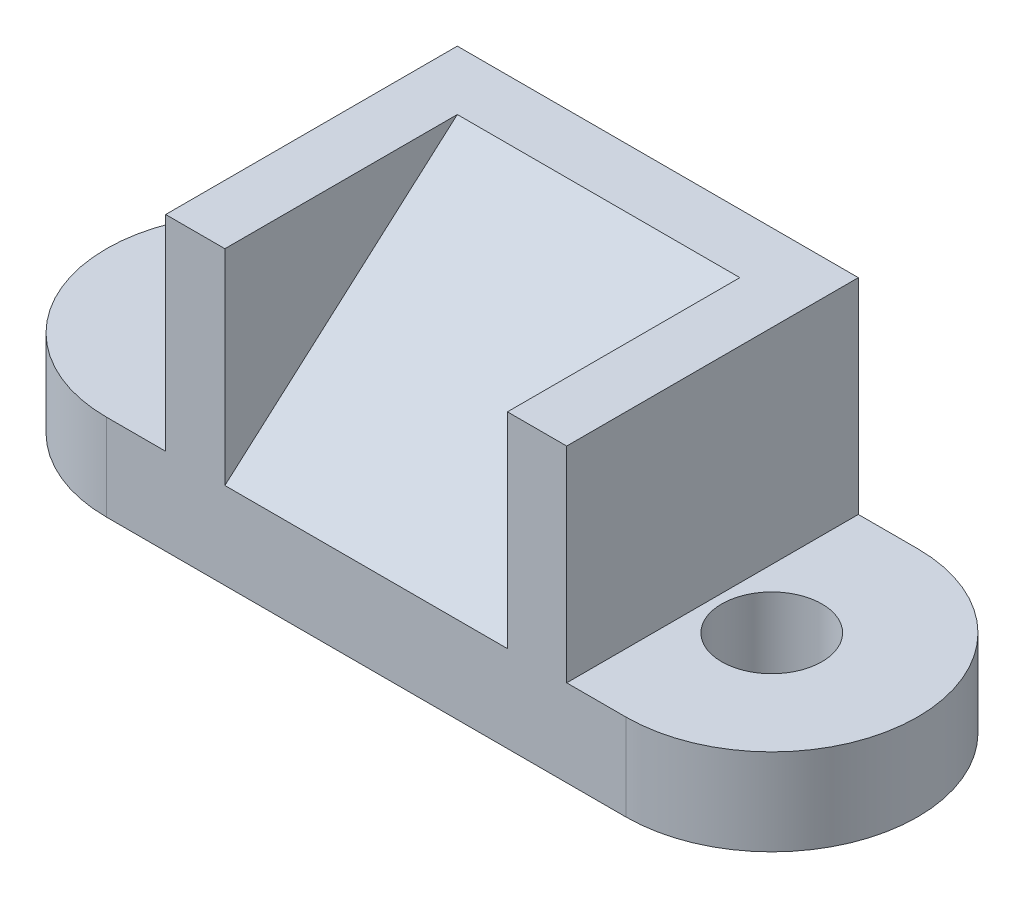
ISO-10303-21;
HEADER;
FILE_DESCRIPTION(('STEP AP214'),'2;1');
FILE_NAME('part.step','',(''),(''),'','','');
FILE_SCHEMA(('AUTOMOTIVE_DESIGN { 1 0 10303 214 1 1 1 1 }'));
ENDSEC;
DATA;
#1=APPLICATION_CONTEXT('core data for automotive mechanical design processes');
#2=APPLICATION_PROTOCOL_DEFINITION('international standard','automotive_design',2000,#1);
#3=PRODUCT_CONTEXT('',#1,'mechanical');
#4=PRODUCT('Part','Part','',(#3));
#5=PRODUCT_RELATED_PRODUCT_CATEGORY('part','',(#4));
#6=PRODUCT_DEFINITION_FORMATION('','',#4);
#7=PRODUCT_DEFINITION_CONTEXT('part definition',#1,'design');
#8=PRODUCT_DEFINITION('design','',#6,#7);
#9=PRODUCT_DEFINITION_SHAPE('','',#8);
#10=(LENGTH_UNIT() NAMED_UNIT(*) SI_UNIT(.MILLI.,.METRE.));
#11=(NAMED_UNIT(*) PLANE_ANGLE_UNIT() SI_UNIT($,.RADIAN.));
#12=(NAMED_UNIT(*) SI_UNIT($,.STERADIAN.) SOLID_ANGLE_UNIT());
#13=UNCERTAINTY_MEASURE_WITH_UNIT(LENGTH_MEASURE(1.E-05),#10,'distance_accuracy_value','');
#14=(GEOMETRIC_REPRESENTATION_CONTEXT(3) GLOBAL_UNCERTAINTY_ASSIGNED_CONTEXT((#13)) GLOBAL_UNIT_ASSIGNED_CONTEXT((#10,
#11,#12)) REPRESENTATION_CONTEXT('',''));
#15=CARTESIAN_POINT('',(0.,0.,0.));
#16=DIRECTION('',(0.,0.,1.));
#17=DIRECTION('',(1.,0.,0.));
#18=AXIS2_PLACEMENT_3D('',#15,#16,#17);
#19=CARTESIAN_POINT('',(114.,-41.,0.));
#20=DIRECTION('',(0.,1.,0.));
#21=DIRECTION('',(0.,0.,1.));
#22=AXIS2_PLACEMENT_3D('',#19,#20,#21);
#23=CYLINDRICAL_SURFACE('',#22,11.);
#24=CARTESIAN_POINT('',(114.,0.,0.));
#25=DIRECTION('',(0.,1.,0.));
#26=DIRECTION('',(0.,0.,1.));
#27=AXIS2_PLACEMENT_3D('',#24,#25,#26);
#28=CIRCLE('',#27,11.);
#29=CARTESIAN_POINT('',(114.,0.,11.));
#30=VERTEX_POINT('',#29);
#31=EDGE_CURVE('E191',#30,#30,#28,.T.);
#32=ORIENTED_EDGE('',*,*,#31,.F.);
#33=EDGE_LOOP('',(#32));
#34=FACE_BOUND('',#33,.T.);
#35=CARTESIAN_POINT('',(114.,19.,0.));
#36=DIRECTION('',(0.,1.,0.));
#37=DIRECTION('',(0.,0.,1.));
#38=AXIS2_PLACEMENT_3D('',#35,#36,#37);
#39=CIRCLE('',#38,11.);
#40=CARTESIAN_POINT('',(114.,19.,11.));
#41=VERTEX_POINT('',#40);
#42=EDGE_CURVE('E11',#41,#41,#39,.F.);
#43=ORIENTED_EDGE('',*,*,#42,.F.);
#44=EDGE_LOOP('',(#43));
#45=FACE_BOUND('',#44,.T.);
#46=ADVANCED_FACE('F39',(#34,#45),#23,.F.);
#47=CARTESIAN_POINT('',(0.,-32.,0.));
#48=DIRECTION('',(0.,1.,0.));
#49=DIRECTION('',(0.,0.,1.));
#50=AXIS2_PLACEMENT_3D('',#47,#48,#49);
#51=CYLINDRICAL_SURFACE('',#50,11.);
#52=CARTESIAN_POINT('',(0.,0.,0.));
#53=DIRECTION('',(0.,1.,0.));
#54=DIRECTION('',(0.,0.,1.));
#55=AXIS2_PLACEMENT_3D('',#52,#53,#54);
#56=CIRCLE('',#55,11.);
#57=CARTESIAN_POINT('',(0.,0.,11.));
#58=VERTEX_POINT('',#57);
#59=EDGE_CURVE('E192',#58,#58,#56,.T.);
#60=CARTESIAN_POINT('',(0.,19.,0.));
#61=DIRECTION('',(0.,1.,0.));
#62=DIRECTION('',(0.,0.,1.));
#63=AXIS2_PLACEMENT_3D('',#60,#61,#62);
#64=CIRCLE('',#63,11.);
#65=CARTESIAN_POINT('',(0.,19.,11.));
#66=VERTEX_POINT('',#65);
#67=EDGE_CURVE('E47',#66,#66,#64,.T.);
#68=CARTESIAN_POINT('',(0.,0.,11.));
#69=CARTESIAN_POINT('',(0.,0.197916666666661,11.));
#70=CARTESIAN_POINT('',(0.,0.395833333333329,11.));
#71=CARTESIAN_POINT('',(0.,0.791666666666663,11.));
#72=CARTESIAN_POINT('',(0.,0.989583333333328,11.));
#73=CARTESIAN_POINT('',(0.,1.38541666666666,11.));
#74=CARTESIAN_POINT('',(0.,1.58333333333333,11.));
#75=CARTESIAN_POINT('',(0.,1.97916666666666,11.));
#76=CARTESIAN_POINT('',(0.,2.17708333333333,11.));
#77=CARTESIAN_POINT('',(0.,2.57291666666666,11.));
#78=CARTESIAN_POINT('',(0.,2.77083333333333,11.));
#79=CARTESIAN_POINT('',(0.,3.16666666666667,11.));
#80=CARTESIAN_POINT('',(0.,3.36458333333334,11.));
#81=CARTESIAN_POINT('',(0.,3.76041666666667,11.));
#82=CARTESIAN_POINT('',(0.,3.95833333333333,11.));
#83=CARTESIAN_POINT('',(0.,4.35416666666667,11.));
#84=CARTESIAN_POINT('',(0.,4.55208333333334,11.));
#85=CARTESIAN_POINT('',(0.,4.94791666666667,11.));
#86=CARTESIAN_POINT('',(0.,5.14583333333334,11.));
#87=CARTESIAN_POINT('',(0.,5.54166666666667,11.));
#88=CARTESIAN_POINT('',(0.,5.73958333333334,11.));
#89=CARTESIAN_POINT('',(0.,6.13541666666667,11.));
#90=CARTESIAN_POINT('',(0.,6.33333333333334,11.));
#91=CARTESIAN_POINT('',(0.,6.72916666666668,11.));
#92=CARTESIAN_POINT('',(0.,6.92708333333334,11.));
#93=CARTESIAN_POINT('',(0.,7.32291666666668,11.));
#94=CARTESIAN_POINT('',(0.,7.52083333333334,11.));
#95=CARTESIAN_POINT('',(0.,7.91666666666668,11.));
#96=CARTESIAN_POINT('',(0.,8.11458333333335,11.));
#97=CARTESIAN_POINT('',(0.,8.51041666666668,11.));
#98=CARTESIAN_POINT('',(0.,8.70833333333335,11.));
#99=CARTESIAN_POINT('',(0.,9.10416666666668,11.));
#100=CARTESIAN_POINT('',(0.,9.30208333333335,11.));
#101=CARTESIAN_POINT('',(0.,9.69791666666668,11.));
#102=CARTESIAN_POINT('',(0.,9.89583333333335,11.));
#103=CARTESIAN_POINT('',(0.,10.2916666666667,11.));
#104=CARTESIAN_POINT('',(0.,10.4895833333333,11.));
#105=CARTESIAN_POINT('',(0.,10.8854166666667,11.));
#106=CARTESIAN_POINT('',(0.,11.0833333333334,11.));
#107=CARTESIAN_POINT('',(0.,11.4791666666667,11.));
#108=CARTESIAN_POINT('',(0.,11.6770833333334,11.));
#109=CARTESIAN_POINT('',(0.,12.0729166666667,11.));
#110=CARTESIAN_POINT('',(0.,12.2708333333334,11.));
#111=CARTESIAN_POINT('',(0.,12.6666666666667,11.));
#112=CARTESIAN_POINT('',(0.,12.8645833333334,11.));
#113=CARTESIAN_POINT('',(0.,13.2604166666667,11.));
#114=CARTESIAN_POINT('',(0.,13.4583333333334,11.));
#115=CARTESIAN_POINT('',(0.,13.8541666666667,11.));
#116=CARTESIAN_POINT('',(0.,14.0520833333334,11.));
#117=CARTESIAN_POINT('',(0.,14.4479166666667,11.));
#118=CARTESIAN_POINT('',(0.,14.6458333333334,11.));
#119=CARTESIAN_POINT('',(0.,15.0416666666667,11.));
#120=CARTESIAN_POINT('',(0.,15.2395833333334,11.));
#121=CARTESIAN_POINT('',(0.,15.6354166666667,11.));
#122=CARTESIAN_POINT('',(0.,15.8333333333334,11.));
#123=CARTESIAN_POINT('',(0.,16.2291666666667,11.));
#124=CARTESIAN_POINT('',(0.,16.4270833333334,11.));
#125=CARTESIAN_POINT('',(0.,16.8229166666667,11.));
#126=CARTESIAN_POINT('',(0.,17.0208333333334,11.));
#127=CARTESIAN_POINT('',(0.,17.4166666666667,11.));
#128=CARTESIAN_POINT('',(0.,17.6145833333334,11.));
#129=CARTESIAN_POINT('',(0.,18.0104166666667,11.));
#130=CARTESIAN_POINT('',(0.,18.2083333333334,11.));
#131=CARTESIAN_POINT('',(0.,18.6041666666667,11.));
#132=CARTESIAN_POINT('',(0.,18.8020833333334,11.));
#133=CARTESIAN_POINT('',(0.,19.,11.));
#134=B_SPLINE_CURVE_WITH_KNOTS('',3,(#68,#69,#70,#71,#72,#73,#74,#75,#76,#77,#78,#79,#80,#81,
#82,#83,#84,#85,#86,#87,#88,#89,#90,#91,#92,#93,#94,#95,#96,#97,#98,#99,#100,#101,#102,#103,
#104,#105,#106,#107,#108,#109,#110,#111,#112,#113,#114,#115,#116,#117,#118,#119,#120,#121,#122,
#123,#124,#125,#126,#127,#128,#129,#130,#131,#132,#133),.UNSPECIFIED.,.F.,.F.,(4,2,2,2,2,2,2,2,
2,2,2,2,2,2,2,2,2,2,2,2,2,2,2,2,2,2,2,2,2,2,2,2,4),(0.,0.593750000000004,1.1875,
1.78125000000001,2.375,2.96875000000001,3.56250000000001,4.15625000000001,4.75000000000001,
5.34375000000002,5.93750000000001,6.53125000000002,7.12500000000002,7.71875000000002,
8.31250000000002,8.90625000000002,9.50000000000002,10.09375,10.6875,11.28125,11.875,12.46875,
13.0625,13.65625,14.25,14.84375,15.4375,16.03125,16.625,17.21875,17.8125,18.40625,19.),.UNSPECIFIED.);
#135=EDGE_CURVE('BSEAM227',#58,#66,#134,.T.);
#136=ORIENTED_EDGE('',*,*,#59,.F.);
#137=ORIENTED_EDGE('',*,*,#67,.T.);
#138=ORIENTED_EDGE('',*,*,#135,.T.);
#139=ORIENTED_EDGE('',*,*,#135,.F.);
#140=EDGE_LOOP('',(#136,#138,#137,#139));
#141=FACE_BOUND('',#140,.T.);
#142=ADVANCED_FACE('F227',(#141),#51,.F.);
#143=CARTESIAN_POINT('',(114.,64.,0.));
#144=DIRECTION('',(0.,-1.,0.));
#145=DIRECTION('',(0.,0.,-1.));
#146=AXIS2_PLACEMENT_3D('',#143,#144,#145);
#147=CYLINDRICAL_SURFACE('',#146,32.);
#148=CARTESIAN_POINT('',(114.,19.,0.));
#149=DIRECTION('',(0.,1.,0.));
#150=DIRECTION('',(0.,0.,1.));
#151=AXIS2_PLACEMENT_3D('',#148,#149,#150);
#152=CIRCLE('',#151,32.);
#153=CARTESIAN_POINT('',(114.,19.,32.));
#154=VERTEX_POINT('',#153);
#155=CARTESIAN_POINT('',(114.,19.0000000000001,-32.));
#156=VERTEX_POINT('',#155);
#157=EDGE_CURVE('E187',#154,#156,#152,.T.);
#158=ORIENTED_EDGE('',*,*,#157,.F.);
#159=DIRECTION('',(0.,-1.,0.));
#160=VECTOR('',#159,1.);
#161=CARTESIAN_POINT('',(114.,64.,32.));
#162=LINE('',#161,#160);
#163=CARTESIAN_POINT('',(114.,0.,32.));
#164=VERTEX_POINT('',#163);
#165=EDGE_CURVE('E214',#154,#164,#162,.T.);
#166=ORIENTED_EDGE('',*,*,#165,.T.);
#167=CARTESIAN_POINT('',(114.,0.,0.));
#168=DIRECTION('',(0.,1.,0.));
#169=DIRECTION('',(0.,0.,-1.));
#170=AXIS2_PLACEMENT_3D('',#167,#168,#169);
#171=CIRCLE('',#170,32.);
#172=CARTESIAN_POINT('',(114.,0.,-32.));
#173=VERTEX_POINT('',#172);
#174=EDGE_CURVE('E208',#164,#173,#171,.T.);
#175=ORIENTED_EDGE('',*,*,#174,.T.);
#176=DIRECTION('',(0.,-1.,0.));
#177=VECTOR('',#176,1.);
#178=CARTESIAN_POINT('',(114.,64.,-32.));
#179=LINE('',#178,#177);
#180=EDGE_CURVE('E61',#156,#173,#179,.T.);
#181=ORIENTED_EDGE('',*,*,#180,.F.);
#182=EDGE_LOOP('',(#158,#166,#175,#181));
#183=FACE_BOUND('',#182,.T.);
#184=ADVANCED_FACE('F242',(#183),#147,.T.);
#185=CARTESIAN_POINT('',(0.,64.,0.));
#186=DIRECTION('',(0.,-1.,0.));
#187=DIRECTION('',(0.,0.,-1.));
#188=AXIS2_PLACEMENT_3D('',#185,#186,#187);
#189=CYLINDRICAL_SURFACE('',#188,32.);
#190=CARTESIAN_POINT('',(0.,19.,0.));
#191=DIRECTION('',(0.,1.,0.));
#192=DIRECTION('',(0.,0.,1.));
#193=AXIS2_PLACEMENT_3D('',#190,#191,#192);
#194=CIRCLE('',#193,32.);
#195=CARTESIAN_POINT('',(0.,19.,-32.));
#196=VERTEX_POINT('',#195);
#197=CARTESIAN_POINT('',(0.,19.,32.));
#198=VERTEX_POINT('',#197);
#199=EDGE_CURVE('E195',#196,#198,#194,.T.);
#200=ORIENTED_EDGE('',*,*,#199,.F.);
#201=DIRECTION('',(0.,-1.,0.));
#202=VECTOR('',#201,1.);
#203=CARTESIAN_POINT('',(0.,64.,-32.));
#204=LINE('',#203,#202);
#205=CARTESIAN_POINT('',(0.,0.,-32.));
#206=VERTEX_POINT('',#205);
#207=EDGE_CURVE('E54',#196,#206,#204,.T.);
#208=ORIENTED_EDGE('',*,*,#207,.T.);
#209=CARTESIAN_POINT('',(0.,0.,0.));
#210=DIRECTION('',(0.,1.,0.));
#211=DIRECTION('',(0.,0.,1.));
#212=AXIS2_PLACEMENT_3D('',#209,#210,#211);
#213=CIRCLE('',#212,32.);
#214=CARTESIAN_POINT('',(0.,0.,32.));
#215=VERTEX_POINT('',#214);
#216=EDGE_CURVE('E198',#206,#215,#213,.T.);
#217=ORIENTED_EDGE('',*,*,#216,.T.);
#218=DIRECTION('',(0.,-1.,0.));
#219=VECTOR('',#218,1.);
#220=CARTESIAN_POINT('',(0.,64.,32.));
#221=LINE('',#220,#219);
#222=EDGE_CURVE('E216',#198,#215,#221,.T.);
#223=ORIENTED_EDGE('',*,*,#222,.F.);
#224=EDGE_LOOP('',(#200,#208,#217,#223));
#225=FACE_BOUND('',#224,.T.);
#226=ADVANCED_FACE('F41',(#225),#189,.T.);
#227=CARTESIAN_POINT('',(0.,64.,0.));
#228=DIRECTION('',(0.,1.,0.));
#229=DIRECTION('',(0.,0.,1.));
#230=AXIS2_PLACEMENT_3D('',#227,#228,#229);
#231=PLANE('',#230);
#232=DIRECTION('',(0.,0.,1.));
#233=VECTOR('',#232,1.);
#234=CARTESIAN_POINT('',(26.,64.,32.));
#235=LINE('',#234,#233);
#236=CARTESIAN_POINT('',(26.,64.,-19.));
#237=VERTEX_POINT('',#236);
#238=CARTESIAN_POINT('',(26.,64.,32.));
#239=VERTEX_POINT('',#238);
#240=EDGE_CURVE('E144',#237,#239,#235,.T.);
#241=ORIENTED_EDGE('',*,*,#240,.F.);
#242=DIRECTION('',(-1.,0.,0.));
#243=VECTOR('',#242,1.);
#244=CARTESIAN_POINT('',(88.0000000000001,64.,-19.));
#245=LINE('',#244,#243);
#246=CARTESIAN_POINT('',(88.0000000000001,64.,-19.));
#247=VERTEX_POINT('',#246);
#248=EDGE_CURVE('E136',#247,#237,#245,.T.);
#249=ORIENTED_EDGE('',*,*,#248,.F.);
#250=DIRECTION('',(0.,0.,-1.));
#251=VECTOR('',#250,1.);
#252=CARTESIAN_POINT('',(88.0000000000001,64.,-19.));
#253=LINE('',#252,#251);
#254=CARTESIAN_POINT('',(88.0000000000001,64.,32.));
#255=VERTEX_POINT('',#254);
#256=EDGE_CURVE('E150',#255,#247,#253,.T.);
#257=ORIENTED_EDGE('',*,*,#256,.F.);
#258=DIRECTION('',(1.,0.,0.));
#259=VECTOR('',#258,1.);
#260=CARTESIAN_POINT('',(0.,64.,32.));
#261=LINE('',#260,#259);
#262=CARTESIAN_POINT('',(101.,64.,32.));
#263=VERTEX_POINT('',#262);
#264=EDGE_CURVE('E202',#255,#263,#261,.T.);
#265=ORIENTED_EDGE('',*,*,#264,.T.);
#266=DIRECTION('',(0.,0.,1.));
#267=VECTOR('',#266,1.);
#268=CARTESIAN_POINT('',(101.,64.,-32.));
#269=LINE('',#268,#267);
#270=CARTESIAN_POINT('',(101.,64.,-32.));
#271=VERTEX_POINT('',#270);
#272=EDGE_CURVE('E135',#271,#263,#269,.T.);
#273=ORIENTED_EDGE('',*,*,#272,.F.);
#274=DIRECTION('',(-1.,0.,0.));
#275=VECTOR('',#274,1.);
#276=CARTESIAN_POINT('',(0.,64.,-32.));
#277=LINE('',#276,#275);
#278=CARTESIAN_POINT('',(13.,64.,-32.));
#279=VERTEX_POINT('',#278);
#280=EDGE_CURVE('E201',#271,#279,#277,.T.);
#281=ORIENTED_EDGE('',*,*,#280,.T.);
#282=DIRECTION('',(0.,0.,-1.));
#283=VECTOR('',#282,1.);
#284=CARTESIAN_POINT('',(13.,64.,-32.));
#285=LINE('',#284,#283);
#286=CARTESIAN_POINT('',(13.,64.,32.));
#287=VERTEX_POINT('',#286);
#288=EDGE_CURVE('E171',#287,#279,#285,.T.);
#289=ORIENTED_EDGE('',*,*,#288,.F.);
#290=EDGE_CURVE('E199',#287,#239,#261,.T.);
#291=ORIENTED_EDGE('',*,*,#290,.T.);
#292=EDGE_LOOP('',(#241,#249,#257,#265,#273,#281,#289,#291));
#293=FACE_BOUND('',#292,.T.);
#294=ADVANCED_FACE('F257',(#293),#231,.T.);
#295=CARTESIAN_POINT('',(0.,64.,32.));
#296=DIRECTION('',(0.,0.,-1.));
#297=DIRECTION('',(-1.,0.,0.));
#298=AXIS2_PLACEMENT_3D('',#295,#296,#297);
#299=PLANE('',#298);
#300=DIRECTION('',(-1.,0.,0.));
#301=VECTOR('',#300,1.);
#302=CARTESIAN_POINT('',(88.0000000000001,19.,32.));
#303=LINE('',#302,#301);
#304=CARTESIAN_POINT('',(88.0000000000001,19.,32.));
#305=VERTEX_POINT('',#304);
#306=CARTESIAN_POINT('',(26.,19.,32.));
#307=VERTEX_POINT('',#306);
#308=EDGE_CURVE('E124',#305,#307,#303,.T.);
#309=ORIENTED_EDGE('',*,*,#308,.T.);
#310=DIRECTION('',(0.,-1.,0.));
#311=VECTOR('',#310,1.);
#312=CARTESIAN_POINT('',(26.,19.,32.));
#313=LINE('',#312,#311);
#314=EDGE_CURVE('E129',#239,#307,#313,.T.);
#315=ORIENTED_EDGE('',*,*,#314,.F.);
#316=ORIENTED_EDGE('',*,*,#290,.F.);
#317=DIRECTION('',(0.,1.,0.));
#318=VECTOR('',#317,1.);
#319=CARTESIAN_POINT('',(13.,19.,32.));
#320=LINE('',#319,#318);
#321=CARTESIAN_POINT('',(13.,19.,32.));
#322=VERTEX_POINT('',#321);
#323=EDGE_CURVE('E181',#322,#287,#320,.T.);
#324=ORIENTED_EDGE('',*,*,#323,.F.);
#325=DIRECTION('',(1.,0.,0.));
#326=VECTOR('',#325,1.);
#327=CARTESIAN_POINT('',(0.,19.,32.));
#328=LINE('',#327,#326);
#329=EDGE_CURVE('E173',#198,#322,#328,.T.);
#330=ORIENTED_EDGE('',*,*,#329,.F.);
#331=ORIENTED_EDGE('',*,*,#222,.T.);
#332=DIRECTION('',(1.,0.,0.));
#333=VECTOR('',#332,1.);
#334=CARTESIAN_POINT('',(0.,0.,32.));
#335=LINE('',#334,#333);
#336=EDGE_CURVE('E205',#215,#164,#335,.T.);
#337=ORIENTED_EDGE('',*,*,#336,.T.);
#338=ORIENTED_EDGE('',*,*,#165,.F.);
#339=DIRECTION('',(1.,0.,0.));
#340=VECTOR('',#339,1.);
#341=CARTESIAN_POINT('',(101.,19.0000000000001,32.));
#342=LINE('',#341,#340);
#343=CARTESIAN_POINT('',(101.,19.0000000000001,32.));
#344=VERTEX_POINT('',#343);
#345=EDGE_CURVE('E163',#344,#154,#342,.T.);
#346=ORIENTED_EDGE('',*,*,#345,.F.);
#347=DIRECTION('',(0.,1.,0.));
#348=VECTOR('',#347,1.);
#349=CARTESIAN_POINT('',(101.,19.0000000000001,32.));
#350=LINE('',#349,#348);
#351=EDGE_CURVE('E168',#344,#263,#350,.T.);
#352=ORIENTED_EDGE('',*,*,#351,.T.);
#353=ORIENTED_EDGE('',*,*,#264,.F.);
#354=DIRECTION('',(0.,1.,0.));
#355=VECTOR('',#354,1.);
#356=CARTESIAN_POINT('',(88.0000000000001,64.,32.));
#357=LINE('',#356,#355);
#358=EDGE_CURVE('E132',#305,#255,#357,.T.);
#359=ORIENTED_EDGE('',*,*,#358,.F.);
#360=EDGE_LOOP('',(#309,#315,#316,#324,#330,#331,#337,#338,#346,#352,#353,#359));
#361=FACE_BOUND('',#360,.T.);
#362=ADVANCED_FACE('F126',(#361),#299,.F.);
#363=CARTESIAN_POINT('',(0.,64.,-32.));
#364=DIRECTION('',(0.,0.,1.));
#365=DIRECTION('',(1.,0.,0.));
#366=AXIS2_PLACEMENT_3D('',#363,#364,#365);
#367=PLANE('',#366);
#368=ORIENTED_EDGE('',*,*,#280,.F.);
#369=DIRECTION('',(0.,1.,0.));
#370=VECTOR('',#369,1.);
#371=CARTESIAN_POINT('',(101.,19.0000000000001,-32.));
#372=LINE('',#371,#370);
#373=CARTESIAN_POINT('',(101.,19.0000000000001,-32.));
#374=VERTEX_POINT('',#373);
#375=EDGE_CURVE('E165',#374,#271,#372,.T.);
#376=ORIENTED_EDGE('',*,*,#375,.F.);
#377=DIRECTION('',(-1.,0.,0.));
#378=VECTOR('',#377,1.);
#379=CARTESIAN_POINT('',(114.,19.0000000000001,-32.));
#380=LINE('',#379,#378);
#381=EDGE_CURVE('E157',#156,#374,#380,.T.);
#382=ORIENTED_EDGE('',*,*,#381,.F.);
#383=ORIENTED_EDGE('',*,*,#180,.T.);
#384=DIRECTION('',(-1.,0.,0.));
#385=VECTOR('',#384,1.);
#386=CARTESIAN_POINT('',(0.,0.,-32.));
#387=LINE('',#386,#385);
#388=EDGE_CURVE('E210',#173,#206,#387,.T.);
#389=ORIENTED_EDGE('',*,*,#388,.T.);
#390=ORIENTED_EDGE('',*,*,#207,.F.);
#391=DIRECTION('',(-1.,0.,0.));
#392=VECTOR('',#391,1.);
#393=CARTESIAN_POINT('',(0.,19.,-32.));
#394=LINE('',#393,#392);
#395=CARTESIAN_POINT('',(13.,19.,-32.));
#396=VERTEX_POINT('',#395);
#397=EDGE_CURVE('E179',#396,#196,#394,.T.);
#398=ORIENTED_EDGE('',*,*,#397,.F.);
#399=DIRECTION('',(0.,1.,0.));
#400=VECTOR('',#399,1.);
#401=CARTESIAN_POINT('',(13.,19.,-32.));
#402=LINE('',#401,#400);
#403=EDGE_CURVE('E184',#396,#279,#402,.T.);
#404=ORIENTED_EDGE('',*,*,#403,.T.);
#405=EDGE_LOOP('',(#368,#376,#382,#383,#389,#390,#398,#404));
#406=FACE_BOUND('',#405,.T.);
#407=ADVANCED_FACE('F249',(#406),#367,.F.);
#408=CARTESIAN_POINT('',(0.,0.,0.));
#409=DIRECTION('',(0.,1.,0.));
#410=DIRECTION('',(0.,0.,1.));
#411=AXIS2_PLACEMENT_3D('',#408,#409,#410);
#412=PLANE('',#411);
#413=ORIENTED_EDGE('',*,*,#31,.T.);
#414=EDGE_LOOP('',(#413));
#415=FACE_BOUND('',#414,.T.);
#416=ORIENTED_EDGE('',*,*,#59,.T.);
#417=EDGE_LOOP('',(#416));
#418=FACE_BOUND('',#417,.T.);
#419=ORIENTED_EDGE('',*,*,#216,.F.);
#420=ORIENTED_EDGE('',*,*,#388,.F.);
#421=ORIENTED_EDGE('',*,*,#174,.F.);
#422=ORIENTED_EDGE('',*,*,#336,.F.);
#423=EDGE_LOOP('',(#419,#420,#421,#422));
#424=FACE_BOUND('',#423,.T.);
#425=ADVANCED_FACE('F222',(#415,#418,#424),#412,.F.);
#426=CARTESIAN_POINT('',(0.,19.,0.));
#427=DIRECTION('',(0.,1.,0.));
#428=DIRECTION('',(0.,0.,1.));
#429=AXIS2_PLACEMENT_3D('',#426,#427,#428);
#430=PLANE('',#429);
#431=ORIENTED_EDGE('',*,*,#67,.F.);
#432=EDGE_LOOP('',(#431));
#433=FACE_BOUND('',#432,.T.);
#434=ORIENTED_EDGE('',*,*,#397,.T.);
#435=ORIENTED_EDGE('',*,*,#199,.T.);
#436=ORIENTED_EDGE('',*,*,#329,.T.);
#437=DIRECTION('',(0.,0.,-1.));
#438=VECTOR('',#437,1.);
#439=CARTESIAN_POINT('',(13.,19.,-32.));
#440=LINE('',#439,#438);
#441=EDGE_CURVE('E176',#322,#396,#440,.T.);
#442=ORIENTED_EDGE('',*,*,#441,.T.);
#443=EDGE_LOOP('',(#434,#435,#436,#442));
#444=FACE_BOUND('',#443,.T.);
#445=ADVANCED_FACE('F235',(#433,#444),#430,.T.);
#446=CARTESIAN_POINT('',(114.,19.,0.));
#447=DIRECTION('',(0.,1.,0.));
#448=DIRECTION('',(0.,0.,1.));
#449=AXIS2_PLACEMENT_3D('',#446,#447,#448);
#450=PLANE('',#449);
#451=ORIENTED_EDGE('',*,*,#42,.T.);
#452=EDGE_LOOP('',(#451));
#453=FACE_BOUND('',#452,.T.);
#454=ORIENTED_EDGE('',*,*,#157,.T.);
#455=ORIENTED_EDGE('',*,*,#381,.T.);
#456=DIRECTION('',(0.,0.,1.));
#457=VECTOR('',#456,1.);
#458=CARTESIAN_POINT('',(101.,19.0000000000001,-32.));
#459=LINE('',#458,#457);
#460=EDGE_CURVE('E160',#374,#344,#459,.T.);
#461=ORIENTED_EDGE('',*,*,#460,.T.);
#462=ORIENTED_EDGE('',*,*,#345,.T.);
#463=EDGE_LOOP('',(#454,#455,#461,#462));
#464=FACE_BOUND('',#463,.T.);
#465=ADVANCED_FACE('F231',(#453,#464),#450,.T.);
#466=CARTESIAN_POINT('',(13.,19.,-32.));
#467=DIRECTION('',(1.,0.,0.));
#468=DIRECTION('',(0.,0.,-1.));
#469=AXIS2_PLACEMENT_3D('',#466,#467,#468);
#470=PLANE('',#469);
#471=ORIENTED_EDGE('',*,*,#288,.T.);
#472=ORIENTED_EDGE('',*,*,#403,.F.);
#473=ORIENTED_EDGE('',*,*,#441,.F.);
#474=ORIENTED_EDGE('',*,*,#323,.T.);
#475=EDGE_LOOP('',(#471,#472,#473,#474));
#476=FACE_BOUND('',#475,.T.);
#477=ADVANCED_FACE('F234',(#476),#470,.F.);
#478=CARTESIAN_POINT('',(101.,19.0000000000001,-32.));
#479=DIRECTION('',(-1.,0.,0.));
#480=DIRECTION('',(0.,0.,1.));
#481=AXIS2_PLACEMENT_3D('',#478,#479,#480);
#482=PLANE('',#481);
#483=ORIENTED_EDGE('',*,*,#272,.T.);
#484=ORIENTED_EDGE('',*,*,#351,.F.);
#485=ORIENTED_EDGE('',*,*,#460,.F.);
#486=ORIENTED_EDGE('',*,*,#375,.T.);
#487=EDGE_LOOP('',(#483,#484,#485,#486));
#488=FACE_BOUND('',#487,.T.);
#489=ADVANCED_FACE('F260',(#488),#482,.F.);
#490=CARTESIAN_POINT('',(88.0000000000001,64.,-19.));
#491=DIRECTION('',(0.,-0.749837855365093,-0.661621637086846));
#492=DIRECTION('',(0.,0.661621637086846,-0.749837855365093));
#493=AXIS2_PLACEMENT_3D('',#490,#491,#492);
#494=PLANE('',#493);
#495=ORIENTED_EDGE('',*,*,#248,.T.);
#496=DIRECTION('',(0.,0.661621637086846,-0.749837855365093));
#497=VECTOR('',#496,1.);
#498=CARTESIAN_POINT('',(26.,64.,-19.));
#499=LINE('',#498,#497);
#500=EDGE_CURVE('E139',#307,#237,#499,.T.);
#501=ORIENTED_EDGE('',*,*,#500,.F.);
#502=ORIENTED_EDGE('',*,*,#308,.F.);
#503=DIRECTION('',(0.,-0.661621637086846,0.749837855365093));
#504=VECTOR('',#503,1.);
#505=CARTESIAN_POINT('',(88.0000000000001,64.,-19.));
#506=LINE('',#505,#504);
#507=EDGE_CURVE('E153',#247,#305,#506,.T.);
#508=ORIENTED_EDGE('',*,*,#507,.F.);
#509=EDGE_LOOP('',(#495,#501,#502,#508));
#510=FACE_BOUND('',#509,.T.);
#511=ADVANCED_FACE('F140',(#510),#494,.F.);
#512=CARTESIAN_POINT('',(88.0000000000001,0.,0.));
#513=DIRECTION('',(1.,0.,0.));
#514=DIRECTION('',(0.,0.,-1.));
#515=AXIS2_PLACEMENT_3D('',#512,#513,#514);
#516=PLANE('',#515);
#517=ORIENTED_EDGE('',*,*,#256,.T.);
#518=ORIENTED_EDGE('',*,*,#507,.T.);
#519=ORIENTED_EDGE('',*,*,#358,.T.);
#520=EDGE_LOOP('',(#517,#518,#519));
#521=FACE_BOUND('',#520,.T.);
#522=ADVANCED_FACE('F263',(#521),#516,.F.);
#523=CARTESIAN_POINT('',(26.,0.,0.));
#524=DIRECTION('',(-1.,0.,0.));
#525=DIRECTION('',(0.,0.,1.));
#526=AXIS2_PLACEMENT_3D('',#523,#524,#525);
#527=PLANE('',#526);
#528=ORIENTED_EDGE('',*,*,#314,.T.);
#529=ORIENTED_EDGE('',*,*,#500,.T.);
#530=ORIENTED_EDGE('',*,*,#240,.T.);
#531=EDGE_LOOP('',(#528,#529,#530));
#532=FACE_BOUND('',#531,.T.);
#533=ADVANCED_FACE('F146',(#532),#527,.F.);
#534=CLOSED_SHELL('',(#46,#142,#184,#226,#294,#362,#407,#425,#445,#465,#477,#489,#511,#522,#533));
#535=MANIFOLD_SOLID_BREP('B2',#534);
#536=ADVANCED_BREP_SHAPE_REPRESENTATION('',(#18,#535),#14);
#537=SHAPE_DEFINITION_REPRESENTATION(#9,#536);
ENDSEC;
END-ISO-10303-21;
